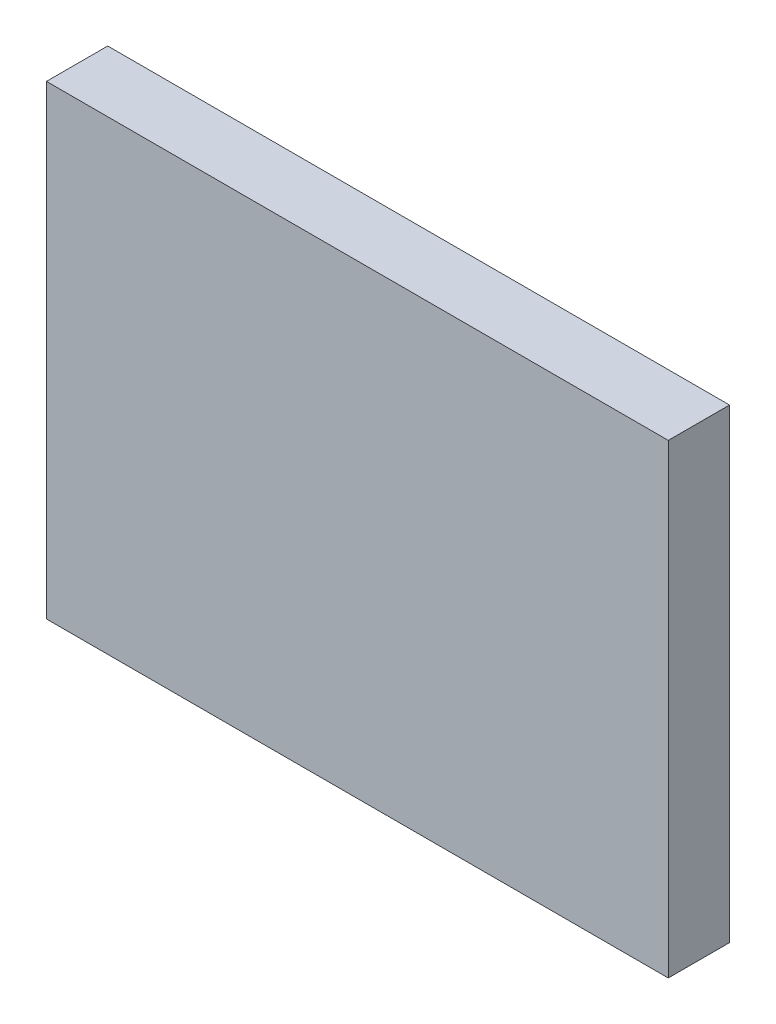
ISO-10303-21;
HEADER;
FILE_DESCRIPTION(('STEP AP214'),'2;1');
FILE_NAME('part.step','',(''),(''),'','','');
FILE_SCHEMA(('AUTOMOTIVE_DESIGN { 1 0 10303 214 1 1 1 1 }'));
ENDSEC;
DATA;
#1=APPLICATION_CONTEXT('core data for automotive mechanical design processes');
#2=APPLICATION_PROTOCOL_DEFINITION('international standard','automotive_design',2000,#1);
#3=PRODUCT_CONTEXT('',#1,'mechanical');
#4=PRODUCT('Part','Part','',(#3));
#5=PRODUCT_RELATED_PRODUCT_CATEGORY('part','',(#4));
#6=PRODUCT_DEFINITION_FORMATION('','',#4);
#7=PRODUCT_DEFINITION_CONTEXT('part definition',#1,'design');
#8=PRODUCT_DEFINITION('design','',#6,#7);
#9=PRODUCT_DEFINITION_SHAPE('','',#8);
#10=(LENGTH_UNIT() NAMED_UNIT(*) SI_UNIT(.MILLI.,.METRE.));
#11=(NAMED_UNIT(*) PLANE_ANGLE_UNIT() SI_UNIT($,.RADIAN.));
#12=(NAMED_UNIT(*) SI_UNIT($,.STERADIAN.) SOLID_ANGLE_UNIT());
#13=UNCERTAINTY_MEASURE_WITH_UNIT(LENGTH_MEASURE(1.E-05),#10,'distance_accuracy_value','');
#14=(GEOMETRIC_REPRESENTATION_CONTEXT(3) GLOBAL_UNCERTAINTY_ASSIGNED_CONTEXT((#13)) GLOBAL_UNIT_ASSIGNED_CONTEXT((#10,
#11,#12)) REPRESENTATION_CONTEXT('',''));
#15=CARTESIAN_POINT('',(0.,0.,0.));
#16=DIRECTION('',(0.,0.,1.));
#17=DIRECTION('',(1.,0.,0.));
#18=AXIS2_PLACEMENT_3D('',#15,#16,#17);
#19=CARTESIAN_POINT('',(-10.1852817416758,12.9477564102564,2.));
#20=DIRECTION('',(1.,0.,0.));
#21=DIRECTION('',(0.,0.,-1.));
#22=AXIS2_PLACEMENT_3D('',#19,#20,#21);
#23=PLANE('',#22);
#24=DIRECTION('',(0.,-1.,0.));
#25=VECTOR('',#24,1.);
#26=CARTESIAN_POINT('',(-10.1852817416758,12.9477564102564,0.));
#27=LINE('',#26,#25);
#28=CARTESIAN_POINT('',(-10.1852817416758,12.9477564102564,0.));
#29=VERTEX_POINT('',#28);
#30=CARTESIAN_POINT('',(-10.1852817416758,-2.25224358974359,0.));
#31=VERTEX_POINT('',#30);
#32=EDGE_CURVE('E96',#29,#31,#27,.T.);
#33=ORIENTED_EDGE('',*,*,#32,.T.);
#34=DIRECTION('',(0.,0.,-1.));
#35=VECTOR('',#34,1.);
#36=CARTESIAN_POINT('',(-10.1852817416758,-2.25224358974359,2.));
#37=LINE('',#36,#35);
#38=CARTESIAN_POINT('',(-10.1852817416758,-2.25224358974359,2.));
#39=VERTEX_POINT('',#38);
#40=EDGE_CURVE('E11',#39,#31,#37,.T.);
#41=ORIENTED_EDGE('',*,*,#40,.F.);
#42=DIRECTION('',(0.,-1.,0.));
#43=VECTOR('',#42,1.);
#44=CARTESIAN_POINT('',(-10.1852817416758,12.9477564102564,2.));
#45=LINE('',#44,#43);
#46=CARTESIAN_POINT('',(-10.1852817416758,12.9477564102564,2.));
#47=VERTEX_POINT('',#46);
#48=EDGE_CURVE('E84',#47,#39,#45,.T.);
#49=ORIENTED_EDGE('',*,*,#48,.F.);
#50=DIRECTION('',(0.,0.,-1.));
#51=VECTOR('',#50,1.);
#52=CARTESIAN_POINT('',(-10.1852817416758,12.9477564102564,2.));
#53=LINE('',#52,#51);
#54=EDGE_CURVE('E92',#47,#29,#53,.T.);
#55=ORIENTED_EDGE('',*,*,#54,.T.);
#56=EDGE_LOOP('',(#33,#41,#49,#55));
#57=FACE_BOUND('',#56,.T.);
#58=ADVANCED_FACE('F33',(#57),#23,.F.);
#59=CARTESIAN_POINT('',(-10.1852817416758,-2.25224358974359,2.));
#60=DIRECTION('',(0.,1.,0.));
#61=DIRECTION('',(0.,0.,1.));
#62=AXIS2_PLACEMENT_3D('',#59,#60,#61);
#63=PLANE('',#62);
#64=DIRECTION('',(1.,0.,0.));
#65=VECTOR('',#64,1.);
#66=CARTESIAN_POINT('',(-10.1852817416758,-2.25224358974359,0.));
#67=LINE('',#66,#65);
#68=CARTESIAN_POINT('',(10.1147182583242,-2.25224358974359,0.));
#69=VERTEX_POINT('',#68);
#70=EDGE_CURVE('E88',#31,#69,#67,.T.);
#71=ORIENTED_EDGE('',*,*,#70,.T.);
#72=DIRECTION('',(0.,0.,-1.));
#73=VECTOR('',#72,1.);
#74=CARTESIAN_POINT('',(10.1147182583242,-2.25224358974359,2.));
#75=LINE('',#74,#73);
#76=CARTESIAN_POINT('',(10.1147182583242,-2.25224358974359,2.));
#77=VERTEX_POINT('',#76);
#78=EDGE_CURVE('E41',#77,#69,#75,.T.);
#79=ORIENTED_EDGE('',*,*,#78,.F.);
#80=DIRECTION('',(1.,0.,0.));
#81=VECTOR('',#80,1.);
#82=CARTESIAN_POINT('',(-10.1852817416758,-2.25224358974359,2.));
#83=LINE('',#82,#81);
#84=EDGE_CURVE('E79',#39,#77,#83,.T.);
#85=ORIENTED_EDGE('',*,*,#84,.F.);
#86=ORIENTED_EDGE('',*,*,#40,.T.);
#87=EDGE_LOOP('',(#71,#79,#85,#86));
#88=FACE_BOUND('',#87,.T.);
#89=ADVANCED_FACE('F87',(#88),#63,.F.);
#90=CARTESIAN_POINT('',(10.1147182583242,12.9477564102564,2.));
#91=DIRECTION('',(-1.,0.,0.));
#92=DIRECTION('',(0.,0.,1.));
#93=AXIS2_PLACEMENT_3D('',#90,#91,#92);
#94=PLANE('',#93);
#95=DIRECTION('',(0.,1.,0.));
#96=VECTOR('',#95,1.);
#97=CARTESIAN_POINT('',(10.1147182583242,12.9477564102564,0.));
#98=LINE('',#97,#96);
#99=CARTESIAN_POINT('',(10.1147182583242,12.9477564102564,0.));
#100=VERTEX_POINT('',#99);
#101=EDGE_CURVE('E66',#69,#100,#98,.T.);
#102=ORIENTED_EDGE('',*,*,#101,.T.);
#103=DIRECTION('',(0.,0.,-1.));
#104=VECTOR('',#103,1.);
#105=CARTESIAN_POINT('',(10.1147182583242,12.9477564102564,2.));
#106=LINE('',#105,#104);
#107=CARTESIAN_POINT('',(10.1147182583242,12.9477564102564,2.));
#108=VERTEX_POINT('',#107);
#109=EDGE_CURVE('E89',#108,#100,#106,.T.);
#110=ORIENTED_EDGE('',*,*,#109,.F.);
#111=DIRECTION('',(0.,1.,0.));
#112=VECTOR('',#111,1.);
#113=CARTESIAN_POINT('',(10.1147182583242,12.9477564102564,2.));
#114=LINE('',#113,#112);
#115=EDGE_CURVE('E82',#77,#108,#114,.T.);
#116=ORIENTED_EDGE('',*,*,#115,.F.);
#117=ORIENTED_EDGE('',*,*,#78,.T.);
#118=EDGE_LOOP('',(#102,#110,#116,#117));
#119=FACE_BOUND('',#118,.T.);
#120=ADVANCED_FACE('F90',(#119),#94,.F.);
#121=CARTESIAN_POINT('',(-10.1852817416758,12.9477564102564,2.));
#122=DIRECTION('',(0.,-1.,0.));
#123=DIRECTION('',(0.,0.,-1.));
#124=AXIS2_PLACEMENT_3D('',#121,#122,#123);
#125=PLANE('',#124);
#126=DIRECTION('',(-1.,0.,0.));
#127=VECTOR('',#126,1.);
#128=CARTESIAN_POINT('',(-10.1852817416758,12.9477564102564,0.));
#129=LINE('',#128,#127);
#130=EDGE_CURVE('E72',#100,#29,#129,.T.);
#131=ORIENTED_EDGE('',*,*,#130,.T.);
#132=ORIENTED_EDGE('',*,*,#54,.F.);
#133=DIRECTION('',(-1.,0.,0.));
#134=VECTOR('',#133,1.);
#135=CARTESIAN_POINT('',(-10.1852817416758,12.9477564102564,2.));
#136=LINE('',#135,#134);
#137=EDGE_CURVE('E49',#108,#47,#136,.T.);
#138=ORIENTED_EDGE('',*,*,#137,.F.);
#139=ORIENTED_EDGE('',*,*,#109,.T.);
#140=EDGE_LOOP('',(#131,#132,#138,#139));
#141=FACE_BOUND('',#140,.T.);
#142=ADVANCED_FACE('F103',(#141),#125,.F.);
#143=CARTESIAN_POINT('',(0.,0.,2.));
#144=DIRECTION('',(0.,0.,1.));
#145=DIRECTION('',(1.,0.,0.));
#146=AXIS2_PLACEMENT_3D('',#143,#144,#145);
#147=PLANE('',#146);
#148=ORIENTED_EDGE('',*,*,#48,.T.);
#149=ORIENTED_EDGE('',*,*,#84,.T.);
#150=ORIENTED_EDGE('',*,*,#115,.T.);
#151=ORIENTED_EDGE('',*,*,#137,.T.);
#152=EDGE_LOOP('',(#148,#149,#150,#151));
#153=FACE_BOUND('',#152,.T.);
#154=ADVANCED_FACE('F80',(#153),#147,.T.);
#155=CARTESIAN_POINT('',(0.,0.,0.));
#156=DIRECTION('',(0.,0.,1.));
#157=DIRECTION('',(1.,0.,0.));
#158=AXIS2_PLACEMENT_3D('',#155,#156,#157);
#159=PLANE('',#158);
#160=ORIENTED_EDGE('',*,*,#32,.F.);
#161=ORIENTED_EDGE('',*,*,#130,.F.);
#162=ORIENTED_EDGE('',*,*,#101,.F.);
#163=ORIENTED_EDGE('',*,*,#70,.F.);
#164=EDGE_LOOP('',(#160,#161,#162,#163));
#165=FACE_BOUND('',#164,.T.);
#166=ADVANCED_FACE('F106',(#165),#159,.F.);
#167=CLOSED_SHELL('',(#58,#89,#120,#142,#154,#166));
#168=MANIFOLD_SOLID_BREP('B2',#167);
#169=ADVANCED_BREP_SHAPE_REPRESENTATION('',(#18,#168),#14);
#170=SHAPE_DEFINITION_REPRESENTATION(#9,#169);
ENDSEC;
END-ISO-10303-21;
